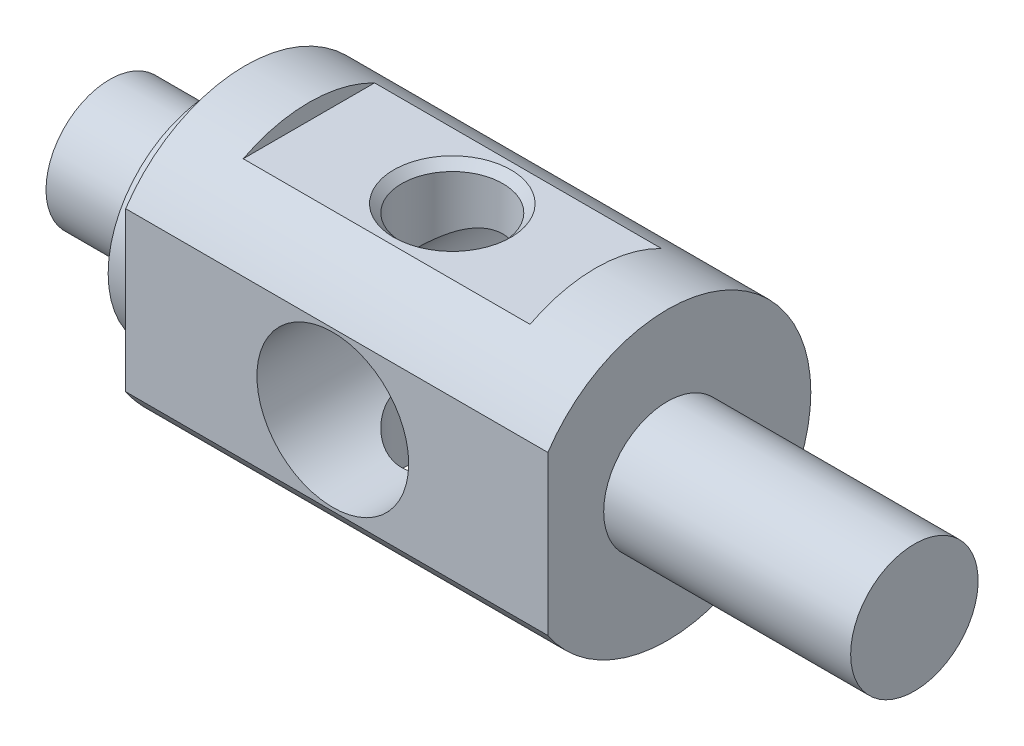
ISO-10303-21;
HEADER;
FILE_DESCRIPTION(('STEP AP214'),'2;1');
FILE_NAME('part.step','',(''),(''),'','','');
FILE_SCHEMA(('AUTOMOTIVE_DESIGN { 1 0 10303 214 1 1 1 1 }'));
ENDSEC;
DATA;
#1=APPLICATION_CONTEXT('core data for automotive mechanical design processes');
#2=APPLICATION_PROTOCOL_DEFINITION('international standard','automotive_design',2000,#1);
#3=PRODUCT_CONTEXT('',#1,'mechanical');
#4=PRODUCT('Part','Part','',(#3));
#5=PRODUCT_RELATED_PRODUCT_CATEGORY('part','',(#4));
#6=PRODUCT_DEFINITION_FORMATION('','',#4);
#7=PRODUCT_DEFINITION_CONTEXT('part definition',#1,'design');
#8=PRODUCT_DEFINITION('design','',#6,#7);
#9=PRODUCT_DEFINITION_SHAPE('','',#8);
#10=(LENGTH_UNIT() NAMED_UNIT(*) SI_UNIT(.MILLI.,.METRE.));
#11=(NAMED_UNIT(*) PLANE_ANGLE_UNIT() SI_UNIT($,.RADIAN.));
#12=(NAMED_UNIT(*) SI_UNIT($,.STERADIAN.) SOLID_ANGLE_UNIT());
#13=UNCERTAINTY_MEASURE_WITH_UNIT(LENGTH_MEASURE(1.E-05),#10,'distance_accuracy_value','');
#14=(GEOMETRIC_REPRESENTATION_CONTEXT(3) GLOBAL_UNCERTAINTY_ASSIGNED_CONTEXT((#13)) GLOBAL_UNIT_ASSIGNED_CONTEXT((#10,
#11,#12)) REPRESENTATION_CONTEXT('',''));
#15=CARTESIAN_POINT('',(0.,0.,0.));
#16=DIRECTION('',(0.,0.,1.));
#17=DIRECTION('',(1.,0.,0.));
#18=AXIS2_PLACEMENT_3D('',#15,#16,#17);
#19=CARTESIAN_POINT('',(-21.5,0.,0.));
#20=DIRECTION('',(-1.,0.,0.));
#21=DIRECTION('',(0.,0.,1.));
#22=AXIS2_PLACEMENT_3D('',#19,#20,#21);
#23=CYLINDRICAL_SURFACE('',#22,9.);
#24=DIRECTION('',(-1.,0.,0.));
#25=VECTOR('',#24,1.);
#26=CARTESIAN_POINT('',(-21.5,8.,4.12310562561766));
#27=LINE('',#26,#25);
#28=CARTESIAN_POINT('',(-9.,8.,4.12310562561766));
#29=VERTEX_POINT('',#28);
#30=CARTESIAN_POINT('',(9.,8.,4.12310562561766));
#31=VERTEX_POINT('',#30);
#32=EDGE_CURVE('E247',#29,#31,#27,.F.);
#33=ORIENTED_EDGE('',*,*,#32,.F.);
#34=CARTESIAN_POINT('',(-9.,0.,0.));
#35=DIRECTION('',(-1.,0.,0.));
#36=DIRECTION('',(0.,0.,1.));
#37=AXIS2_PLACEMENT_3D('',#34,#35,#36);
#38=CIRCLE('',#37,9.);
#39=CARTESIAN_POINT('',(-9.,8.,-4.12310562561766));
#40=VERTEX_POINT('',#39);
#41=EDGE_CURVE('E77',#29,#40,#38,.T.);
#42=ORIENTED_EDGE('',*,*,#41,.T.);
#43=DIRECTION('',(-1.,0.,0.));
#44=VECTOR('',#43,1.);
#45=CARTESIAN_POINT('',(-21.5,8.,-4.12310562561766));
#46=LINE('',#45,#44);
#47=CARTESIAN_POINT('',(9.,8.,-4.12310562561766));
#48=VERTEX_POINT('',#47);
#49=EDGE_CURVE('E119',#48,#40,#46,.T.);
#50=ORIENTED_EDGE('',*,*,#49,.F.);
#51=CARTESIAN_POINT('',(9.,0.,0.));
#52=DIRECTION('',(1.,0.,0.));
#53=DIRECTION('',(0.,0.,-1.));
#54=AXIS2_PLACEMENT_3D('',#51,#52,#53);
#55=CIRCLE('',#54,9.);
#56=EDGE_CURVE('E189',#48,#31,#55,.T.);
#57=ORIENTED_EDGE('',*,*,#56,.T.);
#58=EDGE_LOOP('',(#33,#42,#50,#57));
#59=FACE_BOUND('',#58,.T.);
#60=CARTESIAN_POINT('',(4.7625,0.,-9.));
#61=CARTESIAN_POINT('',(4.76250040344034,0.124347530609337,-9.00000033593268));
#62=CARTESIAN_POINT('',(4.75762497102388,0.248690209153137,-8.99741747917679));
#63=CARTESIAN_POINT('',(4.73818429685444,0.496448267490568,-8.98715281459778));
#64=CARTESIAN_POINT('',(4.72361561012522,0.619863301824312,-8.97946919396871));
#65=CARTESIAN_POINT('',(4.68494604518612,0.864923756681962,-8.95918759669115));
#66=CARTESIAN_POINT('',(4.66083414342587,0.98656696145733,-8.9465839370429));
#67=CARTESIAN_POINT('',(4.60335659926926,1.2271165949106,-8.91677535279601));
#68=CARTESIAN_POINT('',(4.56998717551858,1.34602188371177,-8.89956854808615));
#69=CARTESIAN_POINT('',(4.49453183223207,1.57974647578819,-8.86105868833504));
#70=CARTESIAN_POINT('',(4.45248572241949,1.69458172797125,-8.8397743723139));
#71=CARTESIAN_POINT('',(4.35999791893359,1.9200769121018,-8.79355324714562));
#72=CARTESIAN_POINT('',(4.30955305630161,2.03073524863851,-8.76861505977304));
#73=CARTESIAN_POINT('',(4.14631195388206,2.355441383801,-8.689154350124));
#74=CARTESIAN_POINT('',(4.02153101438027,2.56245973522728,-8.62994450585192));
#75=CARTESIAN_POINT('',(3.73450769966515,2.96653161712556,-8.49986717483721));
#76=CARTESIAN_POINT('',(3.57034891314541,3.16204774981258,-8.42849050207323));
#77=CARTESIAN_POINT('',(3.21341021284217,3.52422455016379,-8.28359383226396));
#78=CARTESIAN_POINT('',(3.02060591709596,3.69086037164852,-8.21007205265056));
#79=CARTESIAN_POINT('',(2.59104583087089,4.00559873450946,-8.06152102346557));
#80=CARTESIAN_POINT('',(2.35190146425856,4.15071118989951,-7.98694495512679));
#81=CARTESIAN_POINT('',(1.97456817015392,4.33614928006894,-7.88687285646168));
#82=CARTESIAN_POINT('',(1.84564222134866,4.39260344965641,-7.85547245236333));
#83=CARTESIAN_POINT('',(1.5823191366162,4.49416795346155,-7.79781135767696));
#84=CARTESIAN_POINT('',(1.44792547419633,4.5392853628367,-7.77154746372517));
#85=CARTESIAN_POINT('',(1.1830798050455,4.61514045974754,-7.72672647724666));
#86=CARTESIAN_POINT('',(1.05289599580195,4.64659346275591,-7.70779393806304));
#87=CARTESIAN_POINT('',(0.789657110491455,4.69849204058019,-7.67626849509927));
#88=CARTESIAN_POINT('',(0.65660369525027,4.71894381365446,-7.66367202174455));
#89=CARTESIAN_POINT('',(0.388873670643937,4.74850579482423,-7.64539058531394));
#90=CARTESIAN_POINT('',(0.254198429728474,4.75762496903582,-7.63970015840158));
#91=CARTESIAN_POINT('',(-0.0155431786148998,4.76438472807634,-7.63548662756686));
#92=CARTESIAN_POINT('',(-0.1506094981826,4.76202666269402,-7.63696268082556));
#93=CARTESIAN_POINT('',(-0.401152716936114,4.7469969845373,-7.64631160227324));
#94=CARTESIAN_POINT('',(-0.516754986564765,4.73579711408422,-7.65327138720916));
#95=CARTESIAN_POINT('',(-0.746443468906819,4.70506908950683,-7.67219908924904));
#96=CARTESIAN_POINT('',(-0.860529202601121,4.68553836552996,-7.68416855168734));
#97=CARTESIAN_POINT('',(-1.19933778505102,4.61477120774495,-7.72703163704495));
#98=CARTESIAN_POINT('',(-1.42076628999166,4.55135015439165,-7.76488652808671));
#99=CARTESIAN_POINT('',(-1.85436132832839,4.39287685995124,-7.85563852081105));
#100=CARTESIAN_POINT('',(-2.06620473013008,4.29714108141298,-7.9088567355142));
#101=CARTESIAN_POINT('',(-2.47192313766677,4.0772854937053,-8.02440970702211));
#102=CARTESIAN_POINT('',(-2.66579009227439,3.95315305196382,-8.08674851676314));
#103=CARTESIAN_POINT('',(-3.05943768140512,3.65923791181625,-8.22435127572942));
#104=CARTESIAN_POINT('',(-3.25603446809802,3.48545254953575,-8.30018223292903));
#105=CARTESIAN_POINT('',(-3.61878837512707,3.10715207855429,-8.44907339742118));
#106=CARTESIAN_POINT('',(-3.78492745789656,2.90261889011612,-8.52213194266733));
#107=CARTESIAN_POINT('',(-4.01229420738898,2.56951895440973,-8.62625299951984));
#108=CARTESIAN_POINT('',(-4.08610651228028,2.45048287630086,-8.66090273193149));
#109=CARTESIAN_POINT('',(-4.2233184790146,2.20559716317462,-8.72647541123955));
#110=CARTESIAN_POINT('',(-4.28672257017004,2.07975045695929,-8.75739994193113));
#111=CARTESIAN_POINT('',(-4.4024166722361,1.82210605452825,-8.81460949891191));
#112=CARTESIAN_POINT('',(-4.45471182057732,1.69031114345429,-8.84089666883255));
#113=CARTESIAN_POINT('',(-4.54756346992604,1.4217082325301,-8.88804394832803));
#114=CARTESIAN_POINT('',(-4.58812150455471,1.28490089025961,-8.90890476689695));
#115=CARTESIAN_POINT('',(-4.65385418760969,1.01980548149451,-8.94294338288788));
#116=CARTESIAN_POINT('',(-4.68007688556574,0.891843215793048,-8.9566398222332));
#117=CARTESIAN_POINT('',(-4.72195515273394,0.633744720642586,-8.97859314111829));
#118=CARTESIAN_POINT('',(-4.73761181149047,0.503608716762799,-8.98685058151237));
#119=CARTESIAN_POINT('',(-4.75813604512215,0.242311954478257,-8.99768728747259));
#120=CARTESIAN_POINT('',(-4.76300848266171,0.111151684704635,-9.00026911220135));
#121=CARTESIAN_POINT('',(-4.76190771489409,-0.15110703256956,-8.99968654248137));
#122=CARTESIAN_POINT('',(-4.75593511011223,-0.282205483091189,-8.99652246620188));
#123=CARTESIAN_POINT('',(-4.73424855064391,-0.531535942882391,-8.98507811945353));
#124=CARTESIAN_POINT('',(-4.71945222443262,-0.649871386958457,-8.97728000824626));
#125=CARTESIAN_POINT('',(-4.68110736184933,-0.884763575078478,-8.95718110814576));
#126=CARTESIAN_POINT('',(-4.65755608471691,-1.00131975020947,-8.9448789092543));
#127=CARTESIAN_POINT('',(-4.60196425659837,-1.23181886042372,-8.91605869083801));
#128=CARTESIAN_POINT('',(-4.56992636841199,-1.34576260303282,-8.89954199373392));
#129=CARTESIAN_POINT('',(-4.49768482213555,-1.57040822753636,-8.86266360437937));
#130=CARTESIAN_POINT('',(-4.45747801634521,-1.68110884089638,-8.84230043019264));
#131=CARTESIAN_POINT('',(-4.32291680123585,-2.01285493333985,-8.77496475562326));
#132=CARTESIAN_POINT('',(-4.21600277364841,-2.22784676260846,-8.72248545363852));
#133=CARTESIAN_POINT('',(-3.97273258849654,-2.63736014731493,-8.60753941243389));
#134=CARTESIAN_POINT('',(-3.83636477814371,-2.83187355544841,-8.54506872287111));
#135=CARTESIAN_POINT('',(-3.52137960502942,-3.21708140633032,-8.40811866059607));
#136=CARTESIAN_POINT('',(-3.33980863724168,-3.40516035248391,-8.33306899481405));
#137=CARTESIAN_POINT('',(-2.94791523306578,-3.74956909780719,-8.18388734030329));
#138=CARTESIAN_POINT('',(-2.73756728995106,-3.90587042157548,-8.10975623003755));
#139=CARTESIAN_POINT('',(-2.39626688930486,-4.11811375214691,-8.00299868949882));
#140=CARTESIAN_POINT('',(-2.27410215022463,-4.18683953100871,-7.96715458296367));
#141=CARTESIAN_POINT('',(-2.02336685114954,-4.31359488157598,-7.89924434073457));
#142=CARTESIAN_POINT('',(-1.8947994215147,-4.37162961630491,-7.86717638413926));
#143=CARTESIAN_POINT('',(-1.6321305650715,-4.47633002878034,-7.80807832339694));
#144=CARTESIAN_POINT('',(-1.49803418007951,-4.52300580779348,-7.7810437482403));
#145=CARTESIAN_POINT('',(-1.22518750903089,-4.6044083186877,-7.73315334237041));
#146=CARTESIAN_POINT('',(-1.08643804422795,-4.6391371471125,-7.71229642764267));
#147=CARTESIAN_POINT('',(-0.819273916993452,-4.69328392273565,-7.67945226514975));
#148=CARTESIAN_POINT('',(-0.691177302945137,-4.71386794672929,-7.66679657998025));
#149=CARTESIAN_POINT('',(-0.433271103101365,-4.74452730742417,-7.64786173290068));
#150=CARTESIAN_POINT('',(-0.303461750092644,-4.75460405762069,-7.64158171330458));
#151=CARTESIAN_POINT('',(-0.0433694510382342,-4.76407931361045,-7.63567808280728));
#152=CARTESIAN_POINT('',(0.0869132157401269,-4.76348333250254,-7.63605103525096));
#153=CARTESIAN_POINT('',(0.34679655585983,-4.75163730961809,-7.64342798657303));
#154=CARTESIAN_POINT('',(0.476397271138804,-4.74038793087339,-7.65043157278294));
#155=CARTESIAN_POINT('',(0.718496074448173,-4.70937876393872,-7.66955263472613));
#156=CARTESIAN_POINT('',(0.83120151623908,-4.69078495106566,-7.6809660561983));
#157=CARTESIAN_POINT('',(1.05447229830989,-4.64569507486617,-7.70832050051003));
#158=CARTESIAN_POINT('',(1.16503697948606,-4.61919661777295,-7.72426289479052));
#159=CARTESIAN_POINT('',(1.49251447862105,-4.52825029307427,-7.77817276738403));
#160=CARTESIAN_POINT('',(1.70535271444985,-4.45233287959253,-7.82223512012185));
#161=CARTESIAN_POINT('',(2.12915698663366,-4.26674886059048,-7.92507095583544));
#162=CARTESIAN_POINT('',(2.33910172027825,-4.15520901106104,-7.98461461078299));
#163=CARTESIAN_POINT('',(2.73873560413043,-3.9034008640743,-8.11068926544477));
#164=CARTESIAN_POINT('',(2.92841376260295,-3.76311709625537,-8.17722401842726));
#165=CARTESIAN_POINT('',(3.3100914927705,-3.43464615735664,-8.32104145757807));
#166=CARTESIAN_POINT('',(3.49861356527532,-3.24248814667078,-8.3985115102675));
#167=CARTESIAN_POINT('',(3.84182536349103,-2.82740321822199,-8.54717875720498));
#168=CARTESIAN_POINT('',(3.99649372834455,-2.60445701771309,-8.61837197410443));
#169=CARTESIAN_POINT('',(4.20079827858228,-2.24812566848557,-8.71559793731253));
#170=CARTESIAN_POINT('',(4.26483700274428,-2.12418324985102,-8.74670425907457));
#171=CARTESIAN_POINT('',(4.38210340700569,-1.87031879401267,-8.80447671148234));
#172=CARTESIAN_POINT('',(4.43533641009264,-1.74039973982838,-8.83114502715428));
#173=CARTESIAN_POINT('',(4.53025646437553,-1.47577336946772,-8.87919744770186));
#174=CARTESIAN_POINT('',(4.57196701465996,-1.34107644039356,-8.90059229762171));
#175=CARTESIAN_POINT('',(4.64339305083211,-1.06781622605154,-8.93749157200341));
#176=CARTESIAN_POINT('',(4.673115276126,-0.92925516003718,-8.95299930570159));
#177=CARTESIAN_POINT('',(4.71847947813409,-0.659351879404655,-8.97676434810901));
#178=CARTESIAN_POINT('',(4.73496634992829,-0.528189374616844,-8.98545571626096));
#179=CARTESIAN_POINT('',(4.75697648476616,-0.26468276068211,-8.99707341002876));
#180=CARTESIAN_POINT('',(4.76249957063286,-0.132338632474631,-8.99999964247885));
#181=CARTESIAN_POINT('',(4.7625,0.,-9.));
#182=B_SPLINE_CURVE_WITH_KNOTS('',3,(#60,#61,#62,#63,#64,#65,#66,#67,#68,#69,#70,#71,#72,#73,
#74,#75,#76,#77,#78,#79,#80,#81,#82,#83,#84,#85,#86,#87,#88,#89,#90,#91,#92,#93,#94,#95,#96,#97,
#98,#99,#100,#101,#102,#103,#104,#105,#106,#107,#108,#109,#110,#111,#112,#113,#114,#115,#116,
#117,#118,#119,#120,#121,#122,#123,#124,#125,#126,#127,#128,#129,#130,#131,#132,#133,#134,#135,
#136,#137,#138,#139,#140,#141,#142,#143,#144,#145,#146,#147,#148,#149,#150,#151,#152,#153,#154,
#155,#156,#157,#158,#159,#160,#161,#162,#163,#164,#165,#166,#167,#168,#169,#170,#171,#172,#173,
#174,#175,#176,#177,#178,#179,#180,#181),.UNSPECIFIED.,.T.,.F.,(4,2,2,2,2,2,2,2,2,2,2,2,2,2,2,2,
2,2,2,2,2,2,2,2,2,2,2,2,2,2,2,2,2,2,2,2,2,2,2,2,2,2,2,2,2,2,2,2,2,2,2,2,2,2,2,2,2,2,2,2,4),(0.,
0.372912735375715,0.745958074537272,1.11943558906099,1.49306588047298,1.86501857493255,
2.23711193135867,2.98054173945517,3.77259683168748,4.56532999470477,5.42895642000663,
5.86105348503776,6.29288020910701,6.69807088525076,7.10303303112271,7.50767457497925,
7.91226853183547,8.26089695162553,8.60963299211596,9.30664673976379,10.0194388201854,
10.7325486128775,11.5485658366515,12.365064769404,12.7974337802674,13.2296183127742,
13.6616025404303,14.0935302976789,14.4870065185386,14.8804421588801,15.2737003607644,
15.666936787325,16.0250536553686,16.3832827273805,16.7413995325868,17.0996545922854,
17.8336908431551,18.5680180341853,19.3805925575267,20.1938920370063,20.6274443207353,
21.0607866771151,21.4937422519301,21.9266218095311,22.3171226184695,22.7075708883476,
23.097817474352,23.4880397743099,23.8320373095211,24.1761391235887,24.8639166558257,
25.5964082992801,26.3292952200101,27.1660025255825,28.0032362606288,28.431539090943,
28.8596304209725,29.2868421381476,29.7138133563692,30.1106846387448,30.5075623345878),.UNSPECIFIED.);
#183=CARTESIAN_POINT('',(4.7625,0.,-9.));
#184=VERTEX_POINT('',#183);
#185=EDGE_CURVE('E181',#184,#184,#182,.T.);
#186=ORIENTED_EDGE('',*,*,#185,.T.);
#187=EDGE_LOOP('',(#186));
#188=FACE_BOUND('',#187,.T.);
#189=CARTESIAN_POINT('',(-13.,0.,0.));
#190=DIRECTION('',(-1.,0.,0.));
#191=DIRECTION('',(0.,0.,1.));
#192=AXIS2_PLACEMENT_3D('',#189,#190,#191);
#193=CIRCLE('',#192,9.);
#194=CARTESIAN_POINT('',(-13.,4.9749371855331,7.5));
#195=VERTEX_POINT('',#194);
#196=CARTESIAN_POINT('',(-13.,-4.9749371855331,7.5));
#197=VERTEX_POINT('',#196);
#198=EDGE_CURVE('E146',#195,#197,#193,.T.);
#199=ORIENTED_EDGE('',*,*,#198,.F.);
#200=DIRECTION('',(-1.,0.,0.));
#201=VECTOR('',#200,1.);
#202=CARTESIAN_POINT('',(-21.5,4.9749371855331,7.5));
#203=LINE('',#202,#201);
#204=CARTESIAN_POINT('',(13.5,4.9749371855331,7.5));
#205=VERTEX_POINT('',#204);
#206=EDGE_CURVE('E160',#205,#195,#203,.T.);
#207=ORIENTED_EDGE('',*,*,#206,.F.);
#208=CARTESIAN_POINT('',(13.5,0.,0.));
#209=DIRECTION('',(-1.,0.,0.));
#210=DIRECTION('',(0.,0.,1.));
#211=AXIS2_PLACEMENT_3D('',#208,#209,#210);
#212=CIRCLE('',#211,9.);
#213=CARTESIAN_POINT('',(13.5,-4.9749371855331,7.5));
#214=VERTEX_POINT('',#213);
#215=EDGE_CURVE('E169',#205,#214,#212,.T.);
#216=ORIENTED_EDGE('',*,*,#215,.T.);
#217=DIRECTION('',(-1.,0.,0.));
#218=VECTOR('',#217,1.);
#219=CARTESIAN_POINT('',(-21.5,-4.9749371855331,7.5));
#220=LINE('',#219,#218);
#221=EDGE_CURVE('E156',#197,#214,#220,.F.);
#222=ORIENTED_EDGE('',*,*,#221,.F.);
#223=EDGE_LOOP('',(#199,#207,#216,#222));
#224=FACE_BOUND('',#223,.T.);
#225=CARTESIAN_POINT('',(-9.,0.,0.));
#226=DIRECTION('',(1.,0.,0.));
#227=DIRECTION('',(0.,0.,-1.));
#228=AXIS2_PLACEMENT_3D('',#225,#226,#227);
#229=CIRCLE('',#228,9.);
#230=CARTESIAN_POINT('',(-9.,-8.,4.12310562561766));
#231=VERTEX_POINT('',#230);
#232=CARTESIAN_POINT('',(-9.,-8.,-4.12310562561766));
#233=VERTEX_POINT('',#232);
#234=EDGE_CURVE('E113',#231,#233,#229,.T.);
#235=ORIENTED_EDGE('',*,*,#234,.F.);
#236=DIRECTION('',(-1.,0.,0.));
#237=VECTOR('',#236,1.);
#238=CARTESIAN_POINT('',(-21.5,-8.,4.12310562561766));
#239=LINE('',#238,#237);
#240=CARTESIAN_POINT('',(9.,-8.,4.12310562561766));
#241=VERTEX_POINT('',#240);
#242=EDGE_CURVE('E115',#241,#231,#239,.T.);
#243=ORIENTED_EDGE('',*,*,#242,.F.);
#244=CARTESIAN_POINT('',(9.,0.,0.));
#245=DIRECTION('',(-1.,0.,0.));
#246=DIRECTION('',(0.,0.,1.));
#247=AXIS2_PLACEMENT_3D('',#244,#245,#246);
#248=CIRCLE('',#247,9.);
#249=CARTESIAN_POINT('',(9.,-8.,-4.12310562561766));
#250=VERTEX_POINT('',#249);
#251=EDGE_CURVE('E118',#250,#241,#248,.T.);
#252=ORIENTED_EDGE('',*,*,#251,.F.);
#253=DIRECTION('',(-1.,0.,0.));
#254=VECTOR('',#253,1.);
#255=CARTESIAN_POINT('',(-21.5,-8.,-4.12310562561766));
#256=LINE('',#255,#254);
#257=EDGE_CURVE('E116',#233,#250,#256,.F.);
#258=ORIENTED_EDGE('',*,*,#257,.F.);
#259=EDGE_LOOP('',(#235,#243,#252,#258));
#260=FACE_BOUND('',#259,.T.);
#261=ADVANCED_FACE('F54',(#59,#188,#224,#260),#23,.T.);
#262=CARTESIAN_POINT('',(0.,8.,0.));
#263=DIRECTION('',(0.,1.,0.));
#264=DIRECTION('',(0.,0.,1.));
#265=AXIS2_PLACEMENT_3D('',#262,#263,#264);
#266=CYLINDRICAL_SURFACE('',#265,3.175);
#267=CARTESIAN_POINT('',(0.,-4.7625,3.175));
#268=CARTESIAN_POINT('',(-0.159513506146526,-4.76249829558771,3.17499785387674));
#269=CARTESIAN_POINT('',(-0.319036822940597,-4.75441585981929,3.16291201378244));
#270=CARTESIAN_POINT('',(-0.632990333269338,-4.72288699141972,3.1153157875296));
#271=CARTESIAN_POINT('',(-0.787418072256468,-4.69943326470019,3.07979428046729));
#272=CARTESIAN_POINT('',(-1.0861866118583,-4.63947623936464,2.98750378332687));
#273=CARTESIAN_POINT('',(-1.23057094564588,-4.60303407934685,2.93083428235374));
#274=CARTESIAN_POINT('',(-1.50719688917279,-4.52002748417047,2.79866196869855));
#275=CARTESIAN_POINT('',(-1.63943673208792,-4.47346157948094,2.72315642160038));
#276=CARTESIAN_POINT('',(-1.90068942785739,-4.36923384005694,2.54848209446027));
#277=CARTESIAN_POINT('',(-2.0284762255929,-4.31096574538352,2.44784901636421));
#278=CARTESIAN_POINT('',(-2.26651828028912,-4.19071922389352,2.22927855246795));
#279=CARTESIAN_POINT('',(-2.37674794067855,-4.12873555797056,2.11131637522972));
#280=CARTESIAN_POINT('',(-2.59432897361932,-3.99618620055343,1.83982936485523));
#281=CARTESIAN_POINT('',(-2.69848308269039,-3.92580920318787,1.68363002512645));
#282=CARTESIAN_POINT('',(-2.87893691841686,-3.79546083955007,1.35197313839848));
#283=CARTESIAN_POINT('',(-2.95528481583057,-3.73547157335728,1.17654958761289));
#284=CARTESIAN_POINT('',(-3.0587003056751,-3.65087323287846,0.862470821626496));
#285=CARTESIAN_POINT('',(-3.09363184983488,-3.62104984276855,0.727823581043086));
#286=CARTESIAN_POINT('',(-3.14564105737718,-3.57597026836952,0.452843098742189));
#287=CARTESIAN_POINT('',(-3.16274949511548,-3.56068897885195,0.31252009390908));
#288=CARTESIAN_POINT('',(-3.17803790572636,-3.54705611398895,0.0294087885536102));
#289=CARTESIAN_POINT('',(-3.17614050629003,-3.54877374048434,-0.113387224758054));
#290=CARTESIAN_POINT('',(-3.1533716036927,-3.56901393593137,-0.396295520403465));
#291=CARTESIAN_POINT('',(-3.13248402562585,-3.58755074204361,-0.536405426371805));
#292=CARTESIAN_POINT('',(-3.07443178311274,-3.63739407712628,-0.804016443958596));
#293=CARTESIAN_POINT('',(-3.03802591942409,-3.66810112544891,-0.93180112117995));
#294=CARTESIAN_POINT('',(-2.95068813219861,-3.73871526235138,-1.17955010979676));
#295=CARTESIAN_POINT('',(-2.89975142875274,-3.77862537744388,-1.29951183185714));
#296=CARTESIAN_POINT('',(-2.77294687249444,-3.87293161809884,-1.55420281498847));
#297=CARTESIAN_POINT('',(-2.69411533030022,-3.92862304429405,-1.68697259197917));
#298=CARTESIAN_POINT('',(-2.51886974692605,-4.04322816135651,-1.93894614005392));
#299=CARTESIAN_POINT('',(-2.42243402035991,-4.10214576296336,-2.05813288170832));
#300=CARTESIAN_POINT('',(-2.19045099950254,-4.23137558230652,-2.30591129113202));
#301=CARTESIAN_POINT('',(-2.05095377025593,-4.30140657245415,-2.43099280228032));
#302=CARTESIAN_POINT('',(-1.74943769853673,-4.43258734804498,-2.6561994350834));
#303=CARTESIAN_POINT('',(-1.58744015020742,-4.493745420159,-2.75634790583761));
#304=CARTESIAN_POINT('',(-1.2777118005163,-4.59018328993748,-2.91064587831311));
#305=CARTESIAN_POINT('',(-1.13340775885306,-4.62818577100373,-2.96996383930038));
#306=CARTESIAN_POINT('',(-0.835082219747428,-4.69118503960837,-3.06721656943045));
#307=CARTESIAN_POINT('',(-0.681069057915084,-4.71619281752454,-3.10516941057244));
#308=CARTESIAN_POINT('',(-0.366689406911035,-4.75100462923954,-3.15779334981527));
#309=CARTESIAN_POINT('',(-0.206298501445476,-4.76074299407139,-3.17236389423949));
#310=CARTESIAN_POINT('',(0.115000912030582,-4.76381945007165,-3.1769797530925));
#311=CARTESIAN_POINT('',(0.275909383071217,-4.75715868774694,-3.16702678202589));
#312=CARTESIAN_POINT('',(0.58174845106177,-4.72915598211032,-3.12479681179543));
#313=CARTESIAN_POINT('',(0.727007443428384,-4.70887816144477,-3.09413703981371));
#314=CARTESIAN_POINT('',(1.00983477297833,-4.65643038239684,-3.01371684845446));
#315=CARTESIAN_POINT('',(1.14740187964354,-4.62425852748367,-2.963953382901));
#316=CARTESIAN_POINT('',(1.42028029136543,-4.54812959640013,-2.84376447844169));
#317=CARTESIAN_POINT('',(1.55495019310494,-4.50357668840463,-2.77227005539697));
#318=CARTESIAN_POINT('',(1.81083430052963,-4.40692945783369,-2.61233715220837));
#319=CARTESIAN_POINT('',(1.93204012275932,-4.35483048266614,-2.52388820764801));
#320=CARTESIAN_POINT('',(2.17781894704302,-4.23790342811905,-2.31678500930826));
#321=CARTESIAN_POINT('',(2.29989360271144,-4.17236523918599,-2.19556606216409));
#322=CARTESIAN_POINT('',(2.52307674305786,-4.04131737275621,-1.93498560490976));
#323=CARTESIAN_POINT('',(2.62417073664106,-3.97580774594569,-1.79561166279185));
#324=CARTESIAN_POINT('',(2.79598082787363,-3.85666740360083,-1.51266141984501));
#325=CARTESIAN_POINT('',(2.86854322403869,-3.80250060257811,-1.37043789728911));
#326=CARTESIAN_POINT('',(2.99237739257786,-3.70584371667973,-1.07335216383611));
#327=CARTESIAN_POINT('',(3.04368748566418,-3.66333266217137,-0.918513308918401));
#328=CARTESIAN_POINT('',(3.11524401668581,-3.60256467927561,-0.627753877826357));
#329=CARTESIAN_POINT('',(3.13941774208684,-3.58132059145467,-0.493439756093284));
#330=CARTESIAN_POINT('',(3.17022488831674,-3.55408653184003,-0.221339911640262));
#331=CARTESIAN_POINT('',(3.17687736084456,-3.54807999179148,-0.0835581242544787));
#332=CARTESIAN_POINT('',(3.17220478264998,-3.55225668535638,0.191520836727936));
#333=CARTESIAN_POINT('',(3.16086908702961,-3.56244950530631,0.328817675150233));
#334=CARTESIAN_POINT('',(3.12097725174618,-3.59744096141944,0.59903291065416));
#335=CARTESIAN_POINT('',(3.09239813794198,-3.6222590824651,0.731945216428471));
#336=CARTESIAN_POINT('',(3.00978981561158,-3.69136350740653,1.02506622898968));
#337=CARTESIAN_POINT('',(2.9510082914772,-3.7390752101256,1.18311132192875));
#338=CARTESIAN_POINT('',(2.81121528101009,-3.84527739400296,1.48508652360585));
#339=CARTESIAN_POINT('',(2.7301725841297,-3.90378297026142,1.62899642711669));
#340=CARTESIAN_POINT('',(2.54632873237353,-4.02617059026332,1.90385549633635));
#341=CARTESIAN_POINT('',(2.44315837250285,-4.09013111420676,2.03452106373605));
#342=CARTESIAN_POINT('',(2.21726660759133,-4.21685775015533,2.27859138405742));
#343=CARTESIAN_POINT('',(2.09453921249741,-4.27962348959933,2.3919908277243));
#344=CARTESIAN_POINT('',(1.88738506601081,-4.37333498138707,2.55491858498312));
#345=CARTESIAN_POINT('',(1.8090134436431,-4.40641312548885,2.61102761986732));
#346=CARTESIAN_POINT('',(1.64665981934885,-4.46961905722943,2.71633779885705));
#347=CARTESIAN_POINT('',(1.56268042207705,-4.49974819878213,2.76554211752335));
#348=CARTESIAN_POINT('',(1.38960715113394,-4.55616827072524,2.85642356224378));
#349=CARTESIAN_POINT('',(1.30051812806183,-4.58246276002165,2.89810767636216));
#350=CARTESIAN_POINT('',(1.11782960098097,-4.63042056995049,2.97335672820606));
#351=CARTESIAN_POINT('',(1.02423169482463,-4.65208551661339,3.00692451716838));
#352=CARTESIAN_POINT('',(0.780235392827379,-4.70058109652365,3.08154139984118));
#353=CARTESIAN_POINT('',(0.627104096318098,-4.72362103868264,3.11642765689178));
#354=CARTESIAN_POINT('',(0.315982580686496,-4.75457565287333,3.16314936096945));
#355=CARTESIAN_POINT('',(0.15799610278521,-4.76250168819872,3.17500212570784));
#356=CARTESIAN_POINT('',(0.,-4.7625,3.175));
#357=B_SPLINE_CURVE_WITH_KNOTS('',3,(#267,#268,#269,#270,#271,#272,#273,#274,#275,#276,#277,
#278,#279,#280,#281,#282,#283,#284,#285,#286,#287,#288,#289,#290,#291,#292,#293,#294,#295,#296,
#297,#298,#299,#300,#301,#302,#303,#304,#305,#306,#307,#308,#309,#310,#311,#312,#313,#314,#315,
#316,#317,#318,#319,#320,#321,#322,#323,#324,#325,#326,#327,#328,#329,#330,#331,#332,#333,#334,
#335,#336,#337,#338,#339,#340,#341,#342,#343,#344,#345,#346,#347,#348,#349,#350,#351,#352,#353,
#354,#355,#356),.UNSPECIFIED.,.T.,.F.,(4,2,2,2,2,2,2,2,2,2,2,2,2,2,2,2,2,2,2,2,2,2,2,2,2,2,2,2,
2,2,2,2,2,2,2,2,2,2,2,2,2,2,2,2,4),(0.,0.477921997077321,0.956070945278542,1.43199826818949,
1.90799472139476,2.42438283538384,2.94151703421855,3.54023109732372,4.13790297394634,
4.56300988710696,4.98738156455221,5.41348154879912,5.83994255655571,6.24758818745148,
6.65536806800919,7.14609274784493,7.63742604761197,8.23466340273951,8.83133933988769,
9.3110698922896,9.79039404549572,10.2717740223998,10.7531203456965,11.2006552211841,
11.6482614879236,12.1229810060221,12.5979944723587,13.1481222963466,13.6986288317687,
14.2025677230621,14.705593948025,15.1181442623597,15.5302458053914,15.9425913096207,
16.3554874162604,16.8784049132826,17.4020593249786,17.9352455177247,18.4685953331297,
18.7739424593008,19.0791487337135,19.3840699212457,19.6888838348844,20.1626158186784,
20.635991489477),.UNSPECIFIED.);
#358=CARTESIAN_POINT('',(0.,-4.7625,3.175));
#359=VERTEX_POINT('',#358);
#360=EDGE_CURVE('E136',#359,#359,#357,.T.);
#361=ORIENTED_EDGE('',*,*,#360,.F.);
#362=EDGE_LOOP('',(#361));
#363=FACE_BOUND('',#362,.T.);
#364=CARTESIAN_POINT('',(0.,-8.,0.));
#365=DIRECTION('',(0.,-1.,0.));
#366=DIRECTION('',(0.,0.,-1.));
#367=AXIS2_PLACEMENT_3D('',#364,#365,#366);
#368=CIRCLE('',#367,3.175);
#369=CARTESIAN_POINT('',(0.,-8.,-3.175));
#370=VERTEX_POINT('',#369);
#371=EDGE_CURVE('E129',#370,#370,#368,.F.);
#372=ORIENTED_EDGE('',*,*,#371,.F.);
#373=EDGE_LOOP('',(#372));
#374=FACE_BOUND('',#373,.T.);
#375=ADVANCED_FACE('F220',(#363,#374),#266,.F.);
#376=CARTESIAN_POINT('',(-15.,0.,-9.));
#377=DIRECTION('',(1.,0.,0.));
#378=DIRECTION('',(0.,0.,-1.));
#379=AXIS2_PLACEMENT_3D('',#376,#377,#378);
#380=PLANE('',#379);
#381=CARTESIAN_POINT('',(-15.,0.,0.));
#382=DIRECTION('',(-1.,0.,0.));
#383=DIRECTION('',(0.,0.,1.));
#384=AXIS2_PLACEMENT_3D('',#381,#382,#383);
#385=CIRCLE('',#384,4.);
#386=CARTESIAN_POINT('',(-15.,0.,4.));
#387=VERTEX_POINT('',#386);
#388=EDGE_CURVE('E166',#387,#387,#385,.T.);
#389=ORIENTED_EDGE('',*,*,#388,.F.);
#390=EDGE_LOOP('',(#389));
#391=FACE_BOUND('',#390,.T.);
#392=CARTESIAN_POINT('',(-15.,0.,0.));
#393=DIRECTION('',(-1.,0.,0.));
#394=DIRECTION('',(0.,0.,1.));
#395=AXIS2_PLACEMENT_3D('',#392,#393,#394);
#396=CIRCLE('',#395,6.6);
#397=CARTESIAN_POINT('',(-15.,0.,6.6));
#398=VERTEX_POINT('',#397);
#399=EDGE_CURVE('E142',#398,#398,#396,.T.);
#400=ORIENTED_EDGE('',*,*,#399,.T.);
#401=EDGE_LOOP('',(#400));
#402=FACE_BOUND('',#401,.T.);
#403=ADVANCED_FACE('F225',(#391,#402),#380,.F.);
#404=CARTESIAN_POINT('',(-21.5,0.,-4.));
#405=DIRECTION('',(1.,0.,0.));
#406=DIRECTION('',(0.,0.,-1.));
#407=AXIS2_PLACEMENT_3D('',#404,#405,#406);
#408=PLANE('',#407);
#409=CARTESIAN_POINT('',(-21.5,0.,0.));
#410=DIRECTION('',(-1.,0.,0.));
#411=DIRECTION('',(0.,0.,1.));
#412=AXIS2_PLACEMENT_3D('',#409,#410,#411);
#413=CIRCLE('',#412,1.7272);
#414=CARTESIAN_POINT('',(-21.5,0.,1.7272));
#415=VERTEX_POINT('',#414);
#416=EDGE_CURVE('E150',#415,#415,#413,.T.);
#417=ORIENTED_EDGE('',*,*,#416,.F.);
#418=EDGE_LOOP('',(#417));
#419=FACE_BOUND('',#418,.T.);
#420=CARTESIAN_POINT('',(-21.5,0.,0.));
#421=DIRECTION('',(-1.,0.,0.));
#422=DIRECTION('',(0.,0.,1.));
#423=AXIS2_PLACEMENT_3D('',#420,#421,#422);
#424=CIRCLE('',#423,4.);
#425=CARTESIAN_POINT('',(-21.5,0.,4.));
#426=VERTEX_POINT('',#425);
#427=EDGE_CURVE('E163',#426,#426,#424,.T.);
#428=ORIENTED_EDGE('',*,*,#427,.T.);
#429=EDGE_LOOP('',(#428));
#430=FACE_BOUND('',#429,.T.);
#431=ADVANCED_FACE('F274',(#419,#430),#408,.F.);
#432=CARTESIAN_POINT('',(-21.5,0.,0.));
#433=DIRECTION('',(-1.,0.,0.));
#434=DIRECTION('',(0.,0.,1.));
#435=AXIS2_PLACEMENT_3D('',#432,#433,#434);
#436=CYLINDRICAL_SURFACE('',#435,4.);
#437=ORIENTED_EDGE('',*,*,#427,.F.);
#438=EDGE_LOOP('',(#437));
#439=FACE_BOUND('',#438,.T.);
#440=ORIENTED_EDGE('',*,*,#388,.T.);
#441=EDGE_LOOP('',(#440));
#442=FACE_BOUND('',#441,.T.);
#443=ADVANCED_FACE('F276',(#439,#442),#436,.T.);
#444=CARTESIAN_POINT('',(-10.79,0.,0.));
#445=DIRECTION('',(-1.,0.,0.));
#446=DIRECTION('',(0.,0.,1.));
#447=AXIS2_PLACEMENT_3D('',#444,#445,#446);
#448=CONICAL_SURFACE('',#447,1.7272,1.02974425867665);
#449=CARTESIAN_POINT('',(-9.75219353881559,0.,0.));
#450=VERTEX_POINT('',#449);
#451=VERTEX_LOOP('',#450);
#452=FACE_BOUND('',#451,.T.);
#453=CARTESIAN_POINT('',(-10.79,0.,0.));
#454=DIRECTION('',(-1.,0.,0.));
#455=DIRECTION('',(0.,0.,1.));
#456=AXIS2_PLACEMENT_3D('',#453,#454,#455);
#457=CIRCLE('',#456,1.7272);
#458=CARTESIAN_POINT('',(-10.79,0.,1.7272));
#459=VERTEX_POINT('',#458);
#460=EDGE_CURVE('E153',#459,#459,#457,.T.);
#461=ORIENTED_EDGE('',*,*,#460,.T.);
#462=EDGE_LOOP('',(#461));
#463=FACE_BOUND('',#462,.T.);
#464=ADVANCED_FACE('F282',(#452,#463),#448,.F.);
#465=CARTESIAN_POINT('',(-21.5,0.,0.));
#466=DIRECTION('',(-1.,0.,0.));
#467=DIRECTION('',(0.,0.,1.));
#468=AXIS2_PLACEMENT_3D('',#465,#466,#467);
#469=CYLINDRICAL_SURFACE('',#468,1.7272);
#470=ORIENTED_EDGE('',*,*,#460,.F.);
#471=EDGE_LOOP('',(#470));
#472=FACE_BOUND('',#471,.T.);
#473=ORIENTED_EDGE('',*,*,#416,.T.);
#474=EDGE_LOOP('',(#473));
#475=FACE_BOUND('',#474,.T.);
#476=ADVANCED_FACE('F300',(#472,#475),#469,.F.);
#477=CARTESIAN_POINT('',(-13.,0.,-0.75));
#478=DIRECTION('',(-1.,0.,0.));
#479=DIRECTION('',(0.,0.,1.));
#480=AXIS2_PLACEMENT_3D('',#477,#478,#479);
#481=PLANE('',#480);
#482=CARTESIAN_POINT('',(-13.,0.,0.));
#483=DIRECTION('',(-1.,0.,0.));
#484=DIRECTION('',(0.,0.,1.));
#485=AXIS2_PLACEMENT_3D('',#482,#483,#484);
#486=CIRCLE('',#485,6.6);
#487=CARTESIAN_POINT('',(-13.,0.,6.6));
#488=VERTEX_POINT('',#487);
#489=EDGE_CURVE('E143',#488,#488,#486,.T.);
#490=ORIENTED_EDGE('',*,*,#489,.F.);
#491=EDGE_LOOP('',(#490));
#492=FACE_BOUND('',#491,.T.);
#493=ORIENTED_EDGE('',*,*,#198,.T.);
#494=DIRECTION('',(0.,-1.,0.));
#495=VECTOR('',#494,1.);
#496=CARTESIAN_POINT('',(-13.,0.,7.5));
#497=LINE('',#496,#495);
#498=EDGE_CURVE('E178',#195,#197,#497,.T.);
#499=ORIENTED_EDGE('',*,*,#498,.F.);
#500=EDGE_LOOP('',(#493,#499));
#501=FACE_BOUND('',#500,.T.);
#502=ADVANCED_FACE('F295',(#492,#501),#481,.T.);
#503=CARTESIAN_POINT('',(-13.,0.,0.));
#504=DIRECTION('',(-1.,0.,0.));
#505=DIRECTION('',(0.,0.,1.));
#506=AXIS2_PLACEMENT_3D('',#503,#504,#505);
#507=CYLINDRICAL_SURFACE('',#506,6.6);
#508=ORIENTED_EDGE('',*,*,#489,.T.);
#509=EDGE_LOOP('',(#508));
#510=FACE_BOUND('',#509,.T.);
#511=ORIENTED_EDGE('',*,*,#399,.F.);
#512=EDGE_LOOP('',(#511));
#513=FACE_BOUND('',#512,.T.);
#514=ADVANCED_FACE('F203',(#510,#513),#507,.T.);
#515=CARTESIAN_POINT('',(29.,0.,0.));
#516=DIRECTION('',(-1.,0.,0.));
#517=DIRECTION('',(0.,0.,1.));
#518=AXIS2_PLACEMENT_3D('',#515,#516,#517);
#519=PLANE('',#518);
#520=CARTESIAN_POINT('',(29.,0.,0.));
#521=DIRECTION('',(-1.,0.,0.));
#522=DIRECTION('',(0.,0.,1.));
#523=AXIS2_PLACEMENT_3D('',#520,#521,#522);
#524=CIRCLE('',#523,4.00000000000001);
#525=CARTESIAN_POINT('',(29.,0.,4.00000000000001));
#526=VERTEX_POINT('',#525);
#527=EDGE_CURVE('E175',#526,#526,#524,.T.);
#528=ORIENTED_EDGE('',*,*,#527,.F.);
#529=EDGE_LOOP('',(#528));
#530=FACE_BOUND('',#529,.T.);
#531=ADVANCED_FACE('F268',(#530),#519,.F.);
#532=CARTESIAN_POINT('',(-21.5,0.,0.));
#533=DIRECTION('',(-1.,0.,0.));
#534=DIRECTION('',(0.,0.,1.));
#535=AXIS2_PLACEMENT_3D('',#532,#533,#534);
#536=CYLINDRICAL_SURFACE('',#535,4.00000000000001);
#537=CARTESIAN_POINT('',(13.5,0.,0.));
#538=DIRECTION('',(-1.,0.,0.));
#539=DIRECTION('',(0.,0.,1.));
#540=AXIS2_PLACEMENT_3D('',#537,#538,#539);
#541=CIRCLE('',#540,4.);
#542=CARTESIAN_POINT('',(13.5,0.,4.));
#543=VERTEX_POINT('',#542);
#544=EDGE_CURVE('E172',#543,#543,#541,.T.);
#545=ORIENTED_EDGE('',*,*,#544,.F.);
#546=EDGE_LOOP('',(#545));
#547=FACE_BOUND('',#546,.T.);
#548=ORIENTED_EDGE('',*,*,#527,.T.);
#549=EDGE_LOOP('',(#548));
#550=FACE_BOUND('',#549,.T.);
#551=ADVANCED_FACE('F260',(#547,#550),#536,.T.);
#552=CARTESIAN_POINT('',(13.5,0.,-4.));
#553=DIRECTION('',(-1.,0.,0.));
#554=DIRECTION('',(0.,0.,1.));
#555=AXIS2_PLACEMENT_3D('',#552,#553,#554);
#556=PLANE('',#555);
#557=ORIENTED_EDGE('',*,*,#544,.T.);
#558=EDGE_LOOP('',(#557));
#559=FACE_BOUND('',#558,.T.);
#560=DIRECTION('',(0.,1.,0.));
#561=VECTOR('',#560,1.);
#562=CARTESIAN_POINT('',(13.5,0.,7.5));
#563=LINE('',#562,#561);
#564=EDGE_CURVE('E158',#214,#205,#563,.T.);
#565=ORIENTED_EDGE('',*,*,#564,.F.);
#566=ORIENTED_EDGE('',*,*,#215,.F.);
#567=EDGE_LOOP('',(#565,#566));
#568=FACE_BOUND('',#567,.T.);
#569=ADVANCED_FACE('F258',(#559,#568),#556,.F.);
#570=CARTESIAN_POINT('',(0.,0.,7.5));
#571=DIRECTION('',(0.,0.,1.));
#572=DIRECTION('',(1.,0.,0.));
#573=AXIS2_PLACEMENT_3D('',#570,#571,#572);
#574=PLANE('',#573);
#575=CARTESIAN_POINT('',(0.,0.,7.5));
#576=DIRECTION('',(0.,0.,1.));
#577=DIRECTION('',(1.,0.,0.));
#578=AXIS2_PLACEMENT_3D('',#575,#576,#577);
#579=CIRCLE('',#578,4.7625);
#580=CARTESIAN_POINT('',(4.7625,0.,7.5));
#581=VERTEX_POINT('',#580);
#582=EDGE_CURVE('E139',#581,#581,#579,.T.);
#583=ORIENTED_EDGE('',*,*,#582,.F.);
#584=EDGE_LOOP('',(#583));
#585=FACE_BOUND('',#584,.T.);
#586=ORIENTED_EDGE('',*,*,#206,.T.);
#587=ORIENTED_EDGE('',*,*,#498,.T.);
#588=ORIENTED_EDGE('',*,*,#221,.T.);
#589=ORIENTED_EDGE('',*,*,#564,.T.);
#590=EDGE_LOOP('',(#586,#587,#588,#589));
#591=FACE_BOUND('',#590,.T.);
#592=ADVANCED_FACE('F200',(#585,#591),#574,.T.);
#593=CARTESIAN_POINT('',(0.,0.,7.5));
#594=DIRECTION('',(0.,0.,1.));
#595=DIRECTION('',(1.,0.,0.));
#596=AXIS2_PLACEMENT_3D('',#593,#594,#595);
#597=CYLINDRICAL_SURFACE('',#596,4.7625);
#598=ORIENTED_EDGE('',*,*,#360,.T.);
#599=EDGE_LOOP('',(#598));
#600=FACE_BOUND('',#599,.T.);
#601=CARTESIAN_POINT('',(0.,4.7625,3.175));
#602=CARTESIAN_POINT('',(0.159513506146526,4.76249829558771,3.17499785387674));
#603=CARTESIAN_POINT('',(0.319036822940597,4.75441585981929,3.16291201378244));
#604=CARTESIAN_POINT('',(0.632990333269338,4.72288699141972,3.1153157875296));
#605=CARTESIAN_POINT('',(0.787418072256468,4.69943326470019,3.07979428046729));
#606=CARTESIAN_POINT('',(1.0861866118583,4.63947623936464,2.98750378332687));
#607=CARTESIAN_POINT('',(1.23057094564588,4.60303407934685,2.93083428235374));
#608=CARTESIAN_POINT('',(1.50719688917279,4.52002748417047,2.79866196869855));
#609=CARTESIAN_POINT('',(1.63943673208792,4.47346157948094,2.72315642160038));
#610=CARTESIAN_POINT('',(1.90068942785739,4.36923384005694,2.54848209446027));
#611=CARTESIAN_POINT('',(2.0284762255929,4.31096574538352,2.44784901636421));
#612=CARTESIAN_POINT('',(2.26651828028912,4.19071922389352,2.22927855246795));
#613=CARTESIAN_POINT('',(2.37674794067855,4.12873555797056,2.11131637522972));
#614=CARTESIAN_POINT('',(2.59432897361932,3.99618620055343,1.83982936485523));
#615=CARTESIAN_POINT('',(2.69848308269039,3.92580920318787,1.68363002512645));
#616=CARTESIAN_POINT('',(2.87893691841686,3.79546083955007,1.35197313839848));
#617=CARTESIAN_POINT('',(2.95528481583057,3.73547157335728,1.17654958761289));
#618=CARTESIAN_POINT('',(3.0587003056751,3.65087323287846,0.862470821626496));
#619=CARTESIAN_POINT('',(3.09363184983488,3.62104984276855,0.727823581043086));
#620=CARTESIAN_POINT('',(3.14564105737718,3.57597026836952,0.452843098742189));
#621=CARTESIAN_POINT('',(3.16274949511548,3.56068897885195,0.31252009390908));
#622=CARTESIAN_POINT('',(3.17803790572636,3.54705611398895,0.0294087885536102));
#623=CARTESIAN_POINT('',(3.17614050629003,3.54877374048434,-0.113387224758054));
#624=CARTESIAN_POINT('',(3.1533716036927,3.56901393593137,-0.396295520403465));
#625=CARTESIAN_POINT('',(3.13248402562585,3.58755074204361,-0.536405426371805));
#626=CARTESIAN_POINT('',(3.07443178311274,3.63739407712628,-0.804016443958596));
#627=CARTESIAN_POINT('',(3.03802591942409,3.66810112544891,-0.93180112117995));
#628=CARTESIAN_POINT('',(2.95068813219861,3.73871526235138,-1.17955010979676));
#629=CARTESIAN_POINT('',(2.89975142875274,3.77862537744388,-1.29951183185714));
#630=CARTESIAN_POINT('',(2.77294687249444,3.87293161809884,-1.55420281498847));
#631=CARTESIAN_POINT('',(2.69411533030022,3.92862304429405,-1.68697259197917));
#632=CARTESIAN_POINT('',(2.51886974692605,4.04322816135651,-1.93894614005392));
#633=CARTESIAN_POINT('',(2.42243402035991,4.10214576296336,-2.05813288170832));
#634=CARTESIAN_POINT('',(2.19045099950254,4.23137558230652,-2.30591129113202));
#635=CARTESIAN_POINT('',(2.05095377025593,4.30140657245415,-2.43099280228032));
#636=CARTESIAN_POINT('',(1.74943769853673,4.43258734804498,-2.6561994350834));
#637=CARTESIAN_POINT('',(1.58744015020742,4.493745420159,-2.75634790583761));
#638=CARTESIAN_POINT('',(1.2777118005163,4.59018328993748,-2.91064587831311));
#639=CARTESIAN_POINT('',(1.13340775885306,4.62818577100373,-2.96996383930038));
#640=CARTESIAN_POINT('',(0.835082219747428,4.69118503960837,-3.06721656943045));
#641=CARTESIAN_POINT('',(0.681069057915084,4.71619281752454,-3.10516941057244));
#642=CARTESIAN_POINT('',(0.366689406911035,4.75100462923954,-3.15779334981527));
#643=CARTESIAN_POINT('',(0.206298501445476,4.76074299407139,-3.17236389423949));
#644=CARTESIAN_POINT('',(-0.115000912030582,4.76381945007165,-3.1769797530925));
#645=CARTESIAN_POINT('',(-0.275909383071217,4.75715868774694,-3.16702678202589));
#646=CARTESIAN_POINT('',(-0.58174845106177,4.72915598211032,-3.12479681179543));
#647=CARTESIAN_POINT('',(-0.727007443428384,4.70887816144477,-3.09413703981371));
#648=CARTESIAN_POINT('',(-1.00983477297833,4.65643038239684,-3.01371684845446));
#649=CARTESIAN_POINT('',(-1.14740187964354,4.62425852748367,-2.963953382901));
#650=CARTESIAN_POINT('',(-1.42028029136543,4.54812959640013,-2.84376447844169));
#651=CARTESIAN_POINT('',(-1.55495019310494,4.50357668840463,-2.77227005539697));
#652=CARTESIAN_POINT('',(-1.81083430052963,4.40692945783369,-2.61233715220837));
#653=CARTESIAN_POINT('',(-1.93204012275932,4.35483048266614,-2.52388820764801));
#654=CARTESIAN_POINT('',(-2.17781894704302,4.23790342811905,-2.31678500930826));
#655=CARTESIAN_POINT('',(-2.29989360271144,4.17236523918599,-2.19556606216409));
#656=CARTESIAN_POINT('',(-2.52307674305786,4.04131737275621,-1.93498560490976));
#657=CARTESIAN_POINT('',(-2.62417073664106,3.97580774594569,-1.79561166279185));
#658=CARTESIAN_POINT('',(-2.79598082787363,3.85666740360083,-1.51266141984501));
#659=CARTESIAN_POINT('',(-2.86854322403869,3.80250060257811,-1.37043789728911));
#660=CARTESIAN_POINT('',(-2.99237739257786,3.70584371667973,-1.07335216383611));
#661=CARTESIAN_POINT('',(-3.04368748566418,3.66333266217137,-0.918513308918401));
#662=CARTESIAN_POINT('',(-3.11524401668581,3.60256467927561,-0.627753877826357));
#663=CARTESIAN_POINT('',(-3.13941774208684,3.58132059145467,-0.493439756093284));
#664=CARTESIAN_POINT('',(-3.17022488831674,3.55408653184003,-0.221339911640262));
#665=CARTESIAN_POINT('',(-3.17687736084456,3.54807999179148,-0.0835581242544787));
#666=CARTESIAN_POINT('',(-3.17220478264998,3.55225668535638,0.191520836727936));
#667=CARTESIAN_POINT('',(-3.16086908702961,3.56244950530631,0.328817675150233));
#668=CARTESIAN_POINT('',(-3.12097725174618,3.59744096141944,0.59903291065416));
#669=CARTESIAN_POINT('',(-3.09239813794198,3.6222590824651,0.731945216428471));
#670=CARTESIAN_POINT('',(-3.00978981561158,3.69136350740653,1.02506622898968));
#671=CARTESIAN_POINT('',(-2.9510082914772,3.7390752101256,1.18311132192875));
#672=CARTESIAN_POINT('',(-2.81121528101009,3.84527739400296,1.48508652360585));
#673=CARTESIAN_POINT('',(-2.7301725841297,3.90378297026142,1.62899642711669));
#674=CARTESIAN_POINT('',(-2.54632873237353,4.02617059026332,1.90385549633635));
#675=CARTESIAN_POINT('',(-2.44315837250285,4.09013111420676,2.03452106373605));
#676=CARTESIAN_POINT('',(-2.21726660759133,4.21685775015533,2.27859138405742));
#677=CARTESIAN_POINT('',(-2.09453921249741,4.27962348959933,2.3919908277243));
#678=CARTESIAN_POINT('',(-1.88738506601081,4.37333498138707,2.55491858498312));
#679=CARTESIAN_POINT('',(-1.8090134436431,4.40641312548885,2.61102761986732));
#680=CARTESIAN_POINT('',(-1.64665981934885,4.46961905722943,2.71633779885705));
#681=CARTESIAN_POINT('',(-1.56268042207705,4.49974819878213,2.76554211752335));
#682=CARTESIAN_POINT('',(-1.38960715113394,4.55616827072524,2.85642356224378));
#683=CARTESIAN_POINT('',(-1.30051812806183,4.58246276002165,2.89810767636216));
#684=CARTESIAN_POINT('',(-1.11782960098097,4.63042056995049,2.97335672820606));
#685=CARTESIAN_POINT('',(-1.02423169482463,4.65208551661339,3.00692451716838));
#686=CARTESIAN_POINT('',(-0.780235392827379,4.70058109652365,3.08154139984118));
#687=CARTESIAN_POINT('',(-0.627104096318098,4.72362103868264,3.11642765689178));
#688=CARTESIAN_POINT('',(-0.315982580686496,4.75457565287333,3.16314936096945));
#689=CARTESIAN_POINT('',(-0.15799610278521,4.76250168819872,3.17500212570784));
#690=CARTESIAN_POINT('',(0.,4.7625,3.175));
#691=B_SPLINE_CURVE_WITH_KNOTS('',3,(#601,#602,#603,#604,#605,#606,#607,#608,#609,#610,#611,
#612,#613,#614,#615,#616,#617,#618,#619,#620,#621,#622,#623,#624,#625,#626,#627,#628,#629,#630,
#631,#632,#633,#634,#635,#636,#637,#638,#639,#640,#641,#642,#643,#644,#645,#646,#647,#648,#649,
#650,#651,#652,#653,#654,#655,#656,#657,#658,#659,#660,#661,#662,#663,#664,#665,#666,#667,#668,
#669,#670,#671,#672,#673,#674,#675,#676,#677,#678,#679,#680,#681,#682,#683,#684,#685,#686,#687,
#688,#689,#690),.UNSPECIFIED.,.T.,.F.,(4,2,2,2,2,2,2,2,2,2,2,2,2,2,2,2,2,2,2,2,2,2,2,2,2,2,2,2,
2,2,2,2,2,2,2,2,2,2,2,2,2,2,2,2,4),(0.,0.477921997077321,0.956070945278542,1.43199826818949,
1.90799472139476,2.42438283538384,2.94151703421855,3.54023109732372,4.13790297394634,
4.56300988710696,4.98738156455221,5.41348154879912,5.83994255655571,6.24758818745148,
6.65536806800919,7.14609274784493,7.63742604761197,8.23466340273951,8.83133933988769,
9.3110698922896,9.79039404549572,10.2717740223998,10.7531203456965,11.2006552211841,
11.6482614879236,12.1229810060221,12.5979944723587,13.1481222963466,13.6986288317687,
14.2025677230621,14.705593948025,15.1181442623597,15.5302458053914,15.9425913096207,
16.3554874162604,16.8784049132826,17.4020593249786,17.9352455177247,18.4685953331297,
18.7739424593008,19.0791487337135,19.3840699212457,19.6888838348844,20.1626158186784,
20.635991489477),.UNSPECIFIED.);
#692=CARTESIAN_POINT('',(0.,4.7625,3.175));
#693=VERTEX_POINT('',#692);
#694=EDGE_CURVE('E125',#693,#693,#691,.T.);
#695=ORIENTED_EDGE('',*,*,#694,.T.);
#696=EDGE_LOOP('',(#695));
#697=FACE_BOUND('',#696,.T.);
#698=ORIENTED_EDGE('',*,*,#582,.T.);
#699=EDGE_LOOP('',(#698));
#700=FACE_BOUND('',#699,.T.);
#701=ORIENTED_EDGE('',*,*,#185,.F.);
#702=EDGE_LOOP('',(#701));
#703=FACE_BOUND('',#702,.T.);
#704=ADVANCED_FACE('F194',(#600,#697,#700,#703),#597,.F.);
#705=CARTESIAN_POINT('',(-9.,8.,10.));
#706=DIRECTION('',(-1.,0.,0.));
#707=DIRECTION('',(0.,0.,1.));
#708=AXIS2_PLACEMENT_3D('',#705,#706,#707);
#709=PLANE('',#708);
#710=DIRECTION('',(0.,0.,1.));
#711=VECTOR('',#710,1.);
#712=CARTESIAN_POINT('',(-9.,8.,10.));
#713=LINE('',#712,#711);
#714=EDGE_CURVE('E133',#40,#29,#713,.T.);
#715=ORIENTED_EDGE('',*,*,#714,.F.);
#716=ORIENTED_EDGE('',*,*,#41,.F.);
#717=EDGE_LOOP('',(#715,#716));
#718=FACE_BOUND('',#717,.T.);
#719=ADVANCED_FACE('F199',(#718),#709,.F.);
#720=CARTESIAN_POINT('',(9.,8.,10.));
#721=DIRECTION('',(1.,0.,0.));
#722=DIRECTION('',(0.,0.,-1.));
#723=AXIS2_PLACEMENT_3D('',#720,#721,#722);
#724=PLANE('',#723);
#725=DIRECTION('',(0.,0.,-1.));
#726=VECTOR('',#725,1.);
#727=CARTESIAN_POINT('',(9.,8.,10.));
#728=LINE('',#727,#726);
#729=EDGE_CURVE('E135',#31,#48,#728,.T.);
#730=ORIENTED_EDGE('',*,*,#729,.F.);
#731=ORIENTED_EDGE('',*,*,#56,.F.);
#732=EDGE_LOOP('',(#730,#731));
#733=FACE_BOUND('',#732,.T.);
#734=ADVANCED_FACE('F232',(#733),#724,.F.);
#735=CARTESIAN_POINT('',(0.,8.,0.));
#736=DIRECTION('',(0.,1.,0.));
#737=DIRECTION('',(0.,0.,1.));
#738=AXIS2_PLACEMENT_3D('',#735,#736,#737);
#739=PLANE('',#738);
#740=CARTESIAN_POINT('',(0.,8.,0.));
#741=DIRECTION('',(0.,1.,0.));
#742=DIRECTION('',(0.,0.,1.));
#743=AXIS2_PLACEMENT_3D('',#740,#741,#742);
#744=CIRCLE('',#743,3.675);
#745=CARTESIAN_POINT('',(0.,8.,3.675));
#746=VERTEX_POINT('',#745);
#747=EDGE_CURVE('E14',#746,#746,#744,.F.);
#748=ORIENTED_EDGE('',*,*,#747,.T.);
#749=EDGE_LOOP('',(#748));
#750=FACE_BOUND('',#749,.T.);
#751=ORIENTED_EDGE('',*,*,#49,.T.);
#752=ORIENTED_EDGE('',*,*,#714,.T.);
#753=ORIENTED_EDGE('',*,*,#32,.T.);
#754=ORIENTED_EDGE('',*,*,#729,.T.);
#755=EDGE_LOOP('',(#751,#752,#753,#754));
#756=FACE_BOUND('',#755,.T.);
#757=ADVANCED_FACE('F229',(#750,#756),#739,.T.);
#758=CARTESIAN_POINT('',(0.,7.5,0.));
#759=DIRECTION('',(0.,1.,0.));
#760=DIRECTION('',(0.,0.,1.));
#761=AXIS2_PLACEMENT_3D('',#758,#759,#760);
#762=CIRCLE('',#761,3.175);
#763=CARTESIAN_POINT('',(0.,7.5,3.175));
#764=VERTEX_POINT('',#763);
#765=EDGE_CURVE('E63',#764,#764,#762,.T.);
#766=ORIENTED_EDGE('',*,*,#765,.T.);
#767=EDGE_LOOP('',(#766));
#768=FACE_BOUND('',#767,.T.);
#769=ORIENTED_EDGE('',*,*,#694,.F.);
#770=EDGE_LOOP('',(#769));
#771=FACE_BOUND('',#770,.T.);
#772=ADVANCED_FACE('F227',(#768,#771),#266,.F.);
#773=CARTESIAN_POINT('',(-9.,-8.,10.));
#774=DIRECTION('',(1.,0.,0.));
#775=DIRECTION('',(0.,0.,-1.));
#776=AXIS2_PLACEMENT_3D('',#773,#774,#775);
#777=PLANE('',#776);
#778=DIRECTION('',(0.,0.,1.));
#779=VECTOR('',#778,1.);
#780=CARTESIAN_POINT('',(-9.,-8.,10.));
#781=LINE('',#780,#779);
#782=EDGE_CURVE('E70',#233,#231,#781,.T.);
#783=ORIENTED_EDGE('',*,*,#782,.T.);
#784=ORIENTED_EDGE('',*,*,#234,.T.);
#785=EDGE_LOOP('',(#783,#784));
#786=FACE_BOUND('',#785,.T.);
#787=ADVANCED_FACE('F127',(#786),#777,.T.);
#788=CARTESIAN_POINT('',(9.,-8.,10.));
#789=DIRECTION('',(-1.,0.,0.));
#790=DIRECTION('',(0.,0.,1.));
#791=AXIS2_PLACEMENT_3D('',#788,#789,#790);
#792=PLANE('',#791);
#793=ORIENTED_EDGE('',*,*,#251,.T.);
#794=DIRECTION('',(0.,0.,-1.));
#795=VECTOR('',#794,1.);
#796=CARTESIAN_POINT('',(9.,-8.,10.));
#797=LINE('',#796,#795);
#798=EDGE_CURVE('E124',#241,#250,#797,.T.);
#799=ORIENTED_EDGE('',*,*,#798,.T.);
#800=EDGE_LOOP('',(#793,#799));
#801=FACE_BOUND('',#800,.T.);
#802=ADVANCED_FACE('F423',(#801),#792,.T.);
#803=CARTESIAN_POINT('',(0.,-8.,0.));
#804=DIRECTION('',(0.,-1.,0.));
#805=DIRECTION('',(0.,0.,1.));
#806=AXIS2_PLACEMENT_3D('',#803,#804,#805);
#807=PLANE('',#806);
#808=ORIENTED_EDGE('',*,*,#371,.T.);
#809=EDGE_LOOP('',(#808));
#810=FACE_BOUND('',#809,.T.);
#811=ORIENTED_EDGE('',*,*,#242,.T.);
#812=ORIENTED_EDGE('',*,*,#782,.F.);
#813=ORIENTED_EDGE('',*,*,#257,.T.);
#814=ORIENTED_EDGE('',*,*,#798,.F.);
#815=EDGE_LOOP('',(#811,#812,#813,#814));
#816=FACE_BOUND('',#815,.T.);
#817=ADVANCED_FACE('F122',(#810,#816),#807,.T.);
#818=CARTESIAN_POINT('',(0.,7.5,0.));
#819=DIRECTION('',(0.,1.,0.));
#820=DIRECTION('',(0.,0.,1.));
#821=AXIS2_PLACEMENT_3D('',#818,#819,#820);
#822=CONICAL_SURFACE('',#821,3.175,0.78539816339745);
#823=ORIENTED_EDGE('',*,*,#747,.F.);
#824=EDGE_LOOP('',(#823));
#825=FACE_BOUND('',#824,.T.);
#826=ORIENTED_EDGE('',*,*,#765,.F.);
#827=EDGE_LOOP('',(#826));
#828=FACE_BOUND('',#827,.T.);
#829=ADVANCED_FACE('F57',(#825,#828),#822,.F.);
#830=CLOSED_SHELL('',(#261,#375,#403,#431,#443,#464,#476,#502,#514,#531,#551,#569,#592,#704,
#719,#734,#757,#772,#787,#802,#817,#829));
#831=MANIFOLD_SOLID_BREP('B2',#830);
#832=ADVANCED_BREP_SHAPE_REPRESENTATION('',(#18,#831),#14);
#833=SHAPE_DEFINITION_REPRESENTATION(#9,#832);
ENDSEC;
END-ISO-10303-21;
